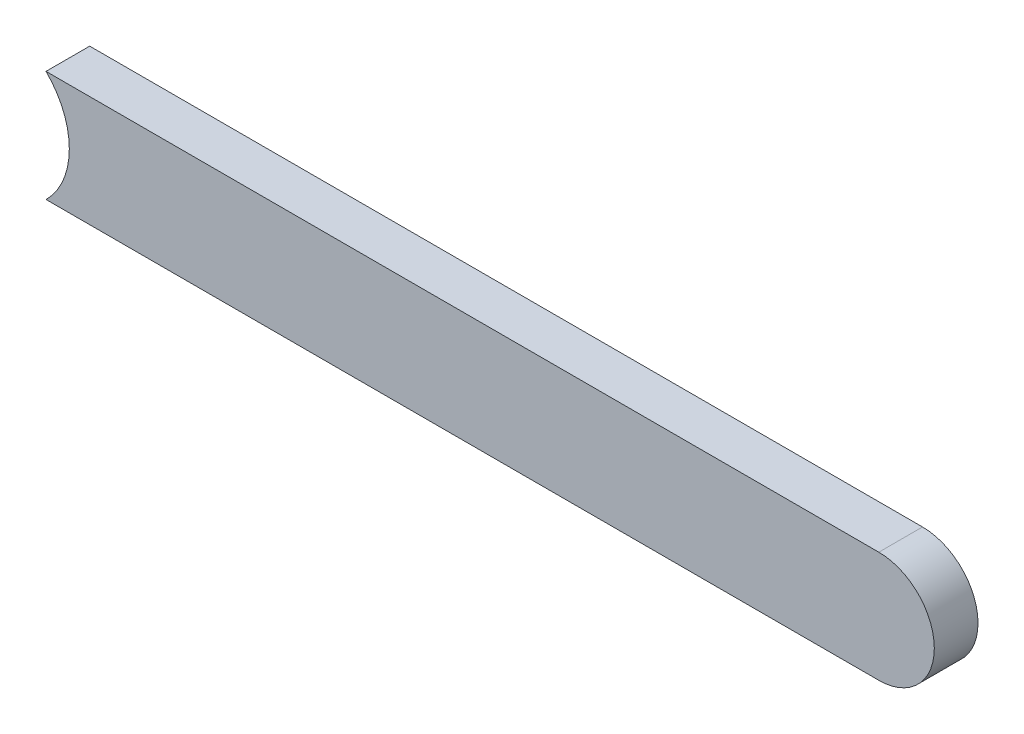
ISO-10303-21;
HEADER;
FILE_DESCRIPTION(('STEP AP214'),'2;1');
FILE_NAME('part.step','',(''),(''),'','','');
FILE_SCHEMA(('AUTOMOTIVE_DESIGN { 1 0 10303 214 1 1 1 1 }'));
ENDSEC;
DATA;
#1=APPLICATION_CONTEXT('core data for automotive mechanical design processes');
#2=APPLICATION_PROTOCOL_DEFINITION('international standard','automotive_design',2000,#1);
#3=PRODUCT_CONTEXT('',#1,'mechanical');
#4=PRODUCT('Part','Part','',(#3));
#5=PRODUCT_RELATED_PRODUCT_CATEGORY('part','',(#4));
#6=PRODUCT_DEFINITION_FORMATION('','',#4);
#7=PRODUCT_DEFINITION_CONTEXT('part definition',#1,'design');
#8=PRODUCT_DEFINITION('design','',#6,#7);
#9=PRODUCT_DEFINITION_SHAPE('','',#8);
#10=(LENGTH_UNIT() NAMED_UNIT(*) SI_UNIT(.MILLI.,.METRE.));
#11=(NAMED_UNIT(*) PLANE_ANGLE_UNIT() SI_UNIT($,.RADIAN.));
#12=(NAMED_UNIT(*) SI_UNIT($,.STERADIAN.) SOLID_ANGLE_UNIT());
#13=UNCERTAINTY_MEASURE_WITH_UNIT(LENGTH_MEASURE(1.E-05),#10,'distance_accuracy_value','');
#14=(GEOMETRIC_REPRESENTATION_CONTEXT(3) GLOBAL_UNCERTAINTY_ASSIGNED_CONTEXT((#13)) GLOBAL_UNIT_ASSIGNED_CONTEXT((#10,
#11,#12)) REPRESENTATION_CONTEXT('',''));
#15=CARTESIAN_POINT('',(0.,0.,0.));
#16=DIRECTION('',(0.,0.,1.));
#17=DIRECTION('',(1.,0.,0.));
#18=AXIS2_PLACEMENT_3D('',#15,#16,#17);
#19=CARTESIAN_POINT('',(87.6248681578668,108.331,0.));
#20=DIRECTION('',(0.,1.,0.));
#21=DIRECTION('',(1.,0.,0.));
#22=AXIS2_PLACEMENT_3D('',#19,#20,#21);
#23=PLANE('',#22);
#24=DIRECTION('',(1.,0.,0.));
#25=VECTOR('',#24,1.);
#26=CARTESIAN_POINT('',(87.376,108.331,0.1999996));
#27=LINE('',#26,#25);
#28=CARTESIAN_POINT('',(87.6248681578668,108.331,0.1999996));
#29=VERTEX_POINT('',#28);
#30=CARTESIAN_POINT('',(91.4370028,108.331,0.1999996));
#31=VERTEX_POINT('',#30);
#32=EDGE_CURVE('E11',#29,#31,#27,.T.);
#33=ORIENTED_EDGE('',*,*,#32,.F.);
#34=DIRECTION('',(0.,0.,1.));
#35=VECTOR('',#34,1.);
#36=CARTESIAN_POINT('',(87.6248681578668,108.331,0.));
#37=LINE('',#36,#35);
#38=CARTESIAN_POINT('',(87.6248681578668,108.331,0.));
#39=VERTEX_POINT('',#38);
#40=EDGE_CURVE('E24',#39,#29,#37,.T.);
#41=ORIENTED_EDGE('',*,*,#40,.F.);
#42=DIRECTION('',(1.,0.,0.));
#43=VECTOR('',#42,1.);
#44=CARTESIAN_POINT('',(87.376,108.331,0.));
#45=LINE('',#44,#43);
#46=CARTESIAN_POINT('',(91.4370028,108.331,0.));
#47=VERTEX_POINT('',#46);
#48=EDGE_CURVE('E82',#39,#47,#45,.T.);
#49=ORIENTED_EDGE('',*,*,#48,.T.);
#50=DIRECTION('',(0.,0.,1.));
#51=VECTOR('',#50,1.);
#52=CARTESIAN_POINT('',(91.4370028,108.331,0.));
#53=LINE('',#52,#51);
#54=EDGE_CURVE('E37',#47,#31,#53,.T.);
#55=ORIENTED_EDGE('',*,*,#54,.T.);
#56=EDGE_LOOP('',(#33,#41,#49,#55));
#57=FACE_BOUND('',#56,.T.);
#58=ADVANCED_FACE('F17',(#57),#23,.F.);
#59=CARTESIAN_POINT('',(91.4370028,108.585,0.));
#60=DIRECTION('',(0.,0.,-1.));
#61=DIRECTION('',(0.,-1.,0.));
#62=AXIS2_PLACEMENT_3D('',#59,#60,#61);
#63=CYLINDRICAL_SURFACE('',#62,0.253999999999995);
#64=CARTESIAN_POINT('',(91.4370028,108.585,0.1999996));
#65=DIRECTION('',(0.,0.,1.));
#66=DIRECTION('',(0.,-1.,0.));
#67=AXIS2_PLACEMENT_3D('',#64,#65,#66);
#68=CIRCLE('',#67,0.253999999999995);
#69=CARTESIAN_POINT('',(91.4370028,108.839,0.1999996));
#70=VERTEX_POINT('',#69);
#71=EDGE_CURVE('E97',#31,#70,#68,.T.);
#72=ORIENTED_EDGE('',*,*,#71,.F.);
#73=ORIENTED_EDGE('',*,*,#54,.F.);
#74=CARTESIAN_POINT('',(91.4370028,108.585,0.));
#75=DIRECTION('',(0.,0.,1.));
#76=DIRECTION('',(0.,-1.,0.));
#77=AXIS2_PLACEMENT_3D('',#74,#75,#76);
#78=CIRCLE('',#77,0.253999999999995);
#79=CARTESIAN_POINT('',(91.4370028,108.839,0.));
#80=VERTEX_POINT('',#79);
#81=EDGE_CURVE('E94',#47,#80,#78,.T.);
#82=ORIENTED_EDGE('',*,*,#81,.T.);
#83=DIRECTION('',(0.,0.,1.));
#84=VECTOR('',#83,1.);
#85=CARTESIAN_POINT('',(91.4370028,108.839,0.));
#86=LINE('',#85,#84);
#87=EDGE_CURVE('E92',#80,#70,#86,.T.);
#88=ORIENTED_EDGE('',*,*,#87,.T.);
#89=EDGE_LOOP('',(#72,#73,#82,#88));
#90=FACE_BOUND('',#89,.T.);
#91=ADVANCED_FACE('F103',(#90),#63,.T.);
#92=CARTESIAN_POINT('',(91.4370028,108.839,0.));
#93=DIRECTION('',(0.,-1.,0.));
#94=DIRECTION('',(-1.,0.,0.));
#95=AXIS2_PLACEMENT_3D('',#92,#93,#94);
#96=PLANE('',#95);
#97=DIRECTION('',(-1.,0.,0.));
#98=VECTOR('',#97,1.);
#99=CARTESIAN_POINT('',(91.4370028,108.839,0.1999996));
#100=LINE('',#99,#98);
#101=CARTESIAN_POINT('',(87.6248681578668,108.839,0.1999996));
#102=VERTEX_POINT('',#101);
#103=EDGE_CURVE('E89',#70,#102,#100,.T.);
#104=ORIENTED_EDGE('',*,*,#103,.F.);
#105=ORIENTED_EDGE('',*,*,#87,.F.);
#106=DIRECTION('',(-1.,0.,0.));
#107=VECTOR('',#106,1.);
#108=CARTESIAN_POINT('',(91.4370028,108.839,0.));
#109=LINE('',#108,#107);
#110=CARTESIAN_POINT('',(87.6248681578668,108.839,0.));
#111=VERTEX_POINT('',#110);
#112=EDGE_CURVE('E87',#80,#111,#109,.T.);
#113=ORIENTED_EDGE('',*,*,#112,.T.);
#114=DIRECTION('',(0.,0.,1.));
#115=VECTOR('',#114,1.);
#116=CARTESIAN_POINT('',(87.6248681578668,108.839,0.));
#117=LINE('',#116,#115);
#118=EDGE_CURVE('E69',#111,#102,#117,.T.);
#119=ORIENTED_EDGE('',*,*,#118,.T.);
#120=EDGE_LOOP('',(#104,#105,#113,#119));
#121=FACE_BOUND('',#120,.T.);
#122=ADVANCED_FACE('F108',(#121),#96,.F.);
#123=CARTESIAN_POINT('',(87.376,108.585,0.));
#124=DIRECTION('',(0.,0.,-1.));
#125=DIRECTION('',(1.,0.,0.));
#126=AXIS2_PLACEMENT_3D('',#123,#124,#125);
#127=CYLINDRICAL_SURFACE('',#126,0.3556);
#128=DIRECTION('',(0.,0.,1.));
#129=VECTOR('',#128,1.);
#130=CARTESIAN_POINT('',(87.7316,108.585,0.));
#131=LINE('',#130,#129);
#132=CARTESIAN_POINT('',(87.7316,108.585,0.));
#133=VERTEX_POINT('',#132);
#134=CARTESIAN_POINT('',(87.7316,108.585,0.1999996));
#135=VERTEX_POINT('',#134);
#136=EDGE_CURVE('E59',#133,#135,#131,.T.);
#137=ORIENTED_EDGE('',*,*,#136,.T.);
#138=CARTESIAN_POINT('',(87.376,108.585,0.1999996));
#139=DIRECTION('',(0.,0.,1.));
#140=DIRECTION('',(1.,0.,0.));
#141=AXIS2_PLACEMENT_3D('',#138,#139,#140);
#142=CIRCLE('',#141,0.3556);
#143=EDGE_CURVE('E70',#135,#102,#142,.T.);
#144=ORIENTED_EDGE('',*,*,#143,.T.);
#145=ORIENTED_EDGE('',*,*,#118,.F.);
#146=CARTESIAN_POINT('',(87.376,108.585,0.));
#147=DIRECTION('',(0.,0.,1.));
#148=DIRECTION('',(1.,0.,0.));
#149=AXIS2_PLACEMENT_3D('',#146,#147,#148);
#150=CIRCLE('',#149,0.3556);
#151=EDGE_CURVE('E73',#133,#111,#150,.T.);
#152=ORIENTED_EDGE('',*,*,#151,.F.);
#153=EDGE_LOOP('',(#137,#144,#145,#152));
#154=FACE_BOUND('',#153,.T.);
#155=ADVANCED_FACE('F74',(#154),#127,.F.);
#156=CARTESIAN_POINT('',(87.376,108.585,0.));
#157=DIRECTION('',(0.,0.,-1.));
#158=DIRECTION('',(1.,0.,0.));
#159=AXIS2_PLACEMENT_3D('',#156,#157,#158);
#160=CYLINDRICAL_SURFACE('',#159,0.3556);
#161=ORIENTED_EDGE('',*,*,#40,.T.);
#162=CARTESIAN_POINT('',(87.376,108.585,0.1999996));
#163=DIRECTION('',(0.,0.,1.));
#164=DIRECTION('',(1.,0.,0.));
#165=AXIS2_PLACEMENT_3D('',#162,#163,#164);
#166=CIRCLE('',#165,0.3556);
#167=EDGE_CURVE('E65',#29,#135,#166,.T.);
#168=ORIENTED_EDGE('',*,*,#167,.T.);
#169=ORIENTED_EDGE('',*,*,#136,.F.);
#170=EDGE_CURVE('E63',#39,#133,#150,.T.);
#171=ORIENTED_EDGE('',*,*,#170,.F.);
#172=EDGE_LOOP('',(#161,#168,#169,#171));
#173=FACE_BOUND('',#172,.T.);
#174=ADVANCED_FACE('F61',(#173),#160,.F.);
#175=CARTESIAN_POINT('',(87.376,108.331,0.));
#176=DIRECTION('',(0.,0.,-1.));
#177=DIRECTION('',(-1.,0.,0.));
#178=AXIS2_PLACEMENT_3D('',#175,#176,#177);
#179=PLANE('',#178);
#180=ORIENTED_EDGE('',*,*,#48,.F.);
#181=ORIENTED_EDGE('',*,*,#170,.T.);
#182=ORIENTED_EDGE('',*,*,#151,.T.);
#183=ORIENTED_EDGE('',*,*,#112,.F.);
#184=ORIENTED_EDGE('',*,*,#81,.F.);
#185=EDGE_LOOP('',(#180,#181,#182,#183,#184));
#186=FACE_BOUND('',#185,.T.);
#187=ADVANCED_FACE('F80',(#186),#179,.T.);
#188=CARTESIAN_POINT('',(87.376,108.331,0.1999996));
#189=DIRECTION('',(0.,0.,-1.));
#190=DIRECTION('',(-1.,0.,0.));
#191=AXIS2_PLACEMENT_3D('',#188,#189,#190);
#192=PLANE('',#191);
#193=ORIENTED_EDGE('',*,*,#167,.F.);
#194=ORIENTED_EDGE('',*,*,#32,.T.);
#195=ORIENTED_EDGE('',*,*,#71,.T.);
#196=ORIENTED_EDGE('',*,*,#103,.T.);
#197=ORIENTED_EDGE('',*,*,#143,.F.);
#198=EDGE_LOOP('',(#193,#194,#195,#196,#197));
#199=FACE_BOUND('',#198,.T.);
#200=ADVANCED_FACE('F106',(#199),#192,.F.);
#201=CLOSED_SHELL('',(#58,#91,#122,#155,#174,#187,#200));
#202=MANIFOLD_SOLID_BREP('B1',#201);
#203=ADVANCED_BREP_SHAPE_REPRESENTATION('',(#18,#202),#14);
#204=SHAPE_DEFINITION_REPRESENTATION(#9,#203);
ENDSEC;
END-ISO-10303-21;
